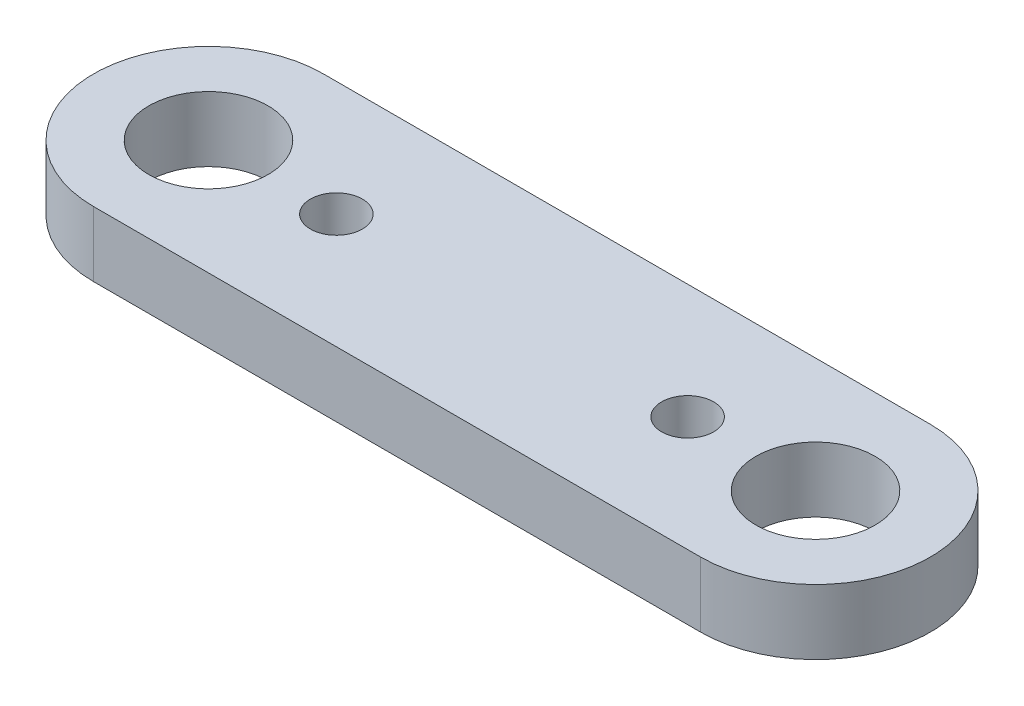
ISO-10303-21;
HEADER;
FILE_DESCRIPTION(('STEP AP214'),'2;1');
FILE_NAME('part.step','',(''),(''),'','','');
FILE_SCHEMA(('AUTOMOTIVE_DESIGN { 1 0 10303 214 1 1 1 1 }'));
ENDSEC;
DATA;
#1=APPLICATION_CONTEXT('core data for automotive mechanical design processes');
#2=APPLICATION_PROTOCOL_DEFINITION('international standard','automotive_design',2000,#1);
#3=PRODUCT_CONTEXT('',#1,'mechanical');
#4=PRODUCT('Part','Part','',(#3));
#5=PRODUCT_RELATED_PRODUCT_CATEGORY('part','',(#4));
#6=PRODUCT_DEFINITION_FORMATION('','',#4);
#7=PRODUCT_DEFINITION_CONTEXT('part definition',#1,'design');
#8=PRODUCT_DEFINITION('design','',#6,#7);
#9=PRODUCT_DEFINITION_SHAPE('','',#8);
#10=(LENGTH_UNIT() NAMED_UNIT(*) SI_UNIT(.MILLI.,.METRE.));
#11=(NAMED_UNIT(*) PLANE_ANGLE_UNIT() SI_UNIT($,.RADIAN.));
#12=(NAMED_UNIT(*) SI_UNIT($,.STERADIAN.) SOLID_ANGLE_UNIT());
#13=UNCERTAINTY_MEASURE_WITH_UNIT(LENGTH_MEASURE(1.E-05),#10,'distance_accuracy_value','');
#14=(GEOMETRIC_REPRESENTATION_CONTEXT(3) GLOBAL_UNCERTAINTY_ASSIGNED_CONTEXT((#13)) GLOBAL_UNIT_ASSIGNED_CONTEXT((#10,
#11,#12)) REPRESENTATION_CONTEXT('',''));
#15=CARTESIAN_POINT('',(0.,0.,0.));
#16=DIRECTION('',(0.,0.,1.));
#17=DIRECTION('',(1.,0.,0.));
#18=AXIS2_PLACEMENT_3D('',#15,#16,#17);
#19=CARTESIAN_POINT('',(14.,3.,0.));
#20=DIRECTION('',(0.,-1.,0.));
#21=DIRECTION('',(0.,0.,-1.));
#22=AXIS2_PLACEMENT_3D('',#19,#20,#21);
#23=PLANE('',#22);
#24=CARTESIAN_POINT('',(14.,3.,0.));
#25=DIRECTION('',(0.,1.,0.));
#26=DIRECTION('',(0.,0.,-1.));
#27=AXIS2_PLACEMENT_3D('',#24,#25,#26);
#28=CIRCLE('',#27,5.3);
#29=CARTESIAN_POINT('',(14.,3.,5.3));
#30=VERTEX_POINT('',#29);
#31=CARTESIAN_POINT('',(14.,3.,-5.3));
#32=VERTEX_POINT('',#31);
#33=EDGE_CURVE('E87',#30,#32,#28,.T.);
#34=ORIENTED_EDGE('',*,*,#33,.T.);
#35=DIRECTION('',(-1.,0.,0.));
#36=VECTOR('',#35,1.);
#37=CARTESIAN_POINT('',(-14.,3.,-5.3));
#38=LINE('',#37,#36);
#39=CARTESIAN_POINT('',(-14.,3.,-5.3));
#40=VERTEX_POINT('',#39);
#41=EDGE_CURVE('E82',#32,#40,#38,.T.);
#42=ORIENTED_EDGE('',*,*,#41,.T.);
#43=CARTESIAN_POINT('',(-14.,3.,0.));
#44=DIRECTION('',(0.,1.,0.));
#45=DIRECTION('',(0.,0.,1.));
#46=AXIS2_PLACEMENT_3D('',#43,#44,#45);
#47=CIRCLE('',#46,5.3);
#48=CARTESIAN_POINT('',(-14.,3.,5.3));
#49=VERTEX_POINT('',#48);
#50=EDGE_CURVE('E85',#40,#49,#47,.T.);
#51=ORIENTED_EDGE('',*,*,#50,.T.);
#52=DIRECTION('',(1.,0.,0.));
#53=VECTOR('',#52,1.);
#54=CARTESIAN_POINT('',(-14.,3.,5.3));
#55=LINE('',#54,#53);
#56=EDGE_CURVE('E52',#49,#30,#55,.T.);
#57=ORIENTED_EDGE('',*,*,#56,.T.);
#58=EDGE_LOOP('',(#34,#42,#51,#57));
#59=FACE_BOUND('',#58,.T.);
#60=CARTESIAN_POINT('',(-14.,3.,0.));
#61=DIRECTION('',(0.,1.,0.));
#62=DIRECTION('',(0.,0.,1.));
#63=AXIS2_PLACEMENT_3D('',#60,#61,#62);
#64=CIRCLE('',#63,2.75);
#65=CARTESIAN_POINT('',(-14.,3.,2.75));
#66=VERTEX_POINT('',#65);
#67=EDGE_CURVE('E102',#66,#66,#64,.T.);
#68=ORIENTED_EDGE('',*,*,#67,.F.);
#69=EDGE_LOOP('',(#68));
#70=FACE_BOUND('',#69,.T.);
#71=CARTESIAN_POINT('',(14.,3.,0.));
#72=DIRECTION('',(0.,1.,0.));
#73=DIRECTION('',(0.,0.,-1.));
#74=AXIS2_PLACEMENT_3D('',#71,#72,#73);
#75=CIRCLE('',#74,2.75);
#76=CARTESIAN_POINT('',(14.,3.,-2.75));
#77=VERTEX_POINT('',#76);
#78=EDGE_CURVE('E117',#77,#77,#75,.T.);
#79=ORIENTED_EDGE('',*,*,#78,.F.);
#80=EDGE_LOOP('',(#79));
#81=FACE_BOUND('',#80,.T.);
#82=CARTESIAN_POINT('',(8.1,3.,0.));
#83=DIRECTION('',(0.,1.,0.));
#84=DIRECTION('',(0.,0.,1.));
#85=AXIS2_PLACEMENT_3D('',#82,#83,#84);
#86=CIRCLE('',#85,1.2);
#87=CARTESIAN_POINT('',(8.1,3.,1.2));
#88=VERTEX_POINT('',#87);
#89=EDGE_CURVE('E123',#88,#88,#86,.T.);
#90=ORIENTED_EDGE('',*,*,#89,.F.);
#91=EDGE_LOOP('',(#90));
#92=FACE_BOUND('',#91,.T.);
#93=CARTESIAN_POINT('',(-8.1,3.,0.));
#94=DIRECTION('',(0.,1.,0.));
#95=DIRECTION('',(0.,0.,-1.));
#96=AXIS2_PLACEMENT_3D('',#93,#94,#95);
#97=CIRCLE('',#96,1.2);
#98=CARTESIAN_POINT('',(-8.1,3.,-1.2));
#99=VERTEX_POINT('',#98);
#100=EDGE_CURVE('E129',#99,#99,#97,.T.);
#101=ORIENTED_EDGE('',*,*,#100,.F.);
#102=EDGE_LOOP('',(#101));
#103=FACE_BOUND('',#102,.T.);
#104=ADVANCED_FACE('F35',(#59,#70,#81,#92,#103),#23,.F.);
#105=CARTESIAN_POINT('',(14.,0.,0.));
#106=DIRECTION('',(0.,-1.,0.));
#107=DIRECTION('',(0.,0.,-1.));
#108=AXIS2_PLACEMENT_3D('',#105,#106,#107);
#109=PLANE('',#108);
#110=CARTESIAN_POINT('',(8.1,0.,0.));
#111=DIRECTION('',(0.,1.,0.));
#112=DIRECTION('',(0.,0.,1.));
#113=AXIS2_PLACEMENT_3D('',#110,#111,#112);
#114=CIRCLE('',#113,1.2);
#115=CARTESIAN_POINT('',(8.1,0.,1.2));
#116=VERTEX_POINT('',#115);
#117=EDGE_CURVE('E126',#116,#116,#114,.T.);
#118=ORIENTED_EDGE('',*,*,#117,.T.);
#119=EDGE_LOOP('',(#118));
#120=FACE_BOUND('',#119,.T.);
#121=CARTESIAN_POINT('',(-14.,0.,0.));
#122=DIRECTION('',(0.,1.,0.));
#123=DIRECTION('',(0.,0.,1.));
#124=AXIS2_PLACEMENT_3D('',#121,#122,#123);
#125=CIRCLE('',#124,2.75);
#126=CARTESIAN_POINT('',(-14.,0.,2.75));
#127=VERTEX_POINT('',#126);
#128=EDGE_CURVE('E114',#127,#127,#125,.T.);
#129=ORIENTED_EDGE('',*,*,#128,.T.);
#130=EDGE_LOOP('',(#129));
#131=FACE_BOUND('',#130,.T.);
#132=CARTESIAN_POINT('',(14.,0.,0.));
#133=DIRECTION('',(0.,1.,0.));
#134=DIRECTION('',(0.,0.,-1.));
#135=AXIS2_PLACEMENT_3D('',#132,#133,#134);
#136=CIRCLE('',#135,5.3);
#137=CARTESIAN_POINT('',(14.,0.,5.3));
#138=VERTEX_POINT('',#137);
#139=CARTESIAN_POINT('',(14.,0.,-5.3));
#140=VERTEX_POINT('',#139);
#141=EDGE_CURVE('E99',#138,#140,#136,.T.);
#142=ORIENTED_EDGE('',*,*,#141,.F.);
#143=DIRECTION('',(1.,0.,0.));
#144=VECTOR('',#143,1.);
#145=CARTESIAN_POINT('',(-14.,0.,5.3));
#146=LINE('',#145,#144);
#147=CARTESIAN_POINT('',(-14.,0.,5.3));
#148=VERTEX_POINT('',#147);
#149=EDGE_CURVE('E75',#148,#138,#146,.T.);
#150=ORIENTED_EDGE('',*,*,#149,.F.);
#151=CARTESIAN_POINT('',(-14.,0.,0.));
#152=DIRECTION('',(0.,1.,0.));
#153=DIRECTION('',(0.,0.,1.));
#154=AXIS2_PLACEMENT_3D('',#151,#152,#153);
#155=CIRCLE('',#154,5.3);
#156=CARTESIAN_POINT('',(-14.,0.,-5.3));
#157=VERTEX_POINT('',#156);
#158=EDGE_CURVE('E69',#157,#148,#155,.T.);
#159=ORIENTED_EDGE('',*,*,#158,.F.);
#160=DIRECTION('',(-1.,0.,0.));
#161=VECTOR('',#160,1.);
#162=CARTESIAN_POINT('',(-14.,0.,-5.3));
#163=LINE('',#162,#161);
#164=EDGE_CURVE('E91',#140,#157,#163,.T.);
#165=ORIENTED_EDGE('',*,*,#164,.F.);
#166=EDGE_LOOP('',(#142,#150,#159,#165));
#167=FACE_BOUND('',#166,.T.);
#168=CARTESIAN_POINT('',(14.,0.,0.));
#169=DIRECTION('',(0.,1.,0.));
#170=DIRECTION('',(0.,0.,-1.));
#171=AXIS2_PLACEMENT_3D('',#168,#169,#170);
#172=CIRCLE('',#171,2.75);
#173=CARTESIAN_POINT('',(14.,0.,-2.75));
#174=VERTEX_POINT('',#173);
#175=EDGE_CURVE('E120',#174,#174,#172,.T.);
#176=ORIENTED_EDGE('',*,*,#175,.T.);
#177=EDGE_LOOP('',(#176));
#178=FACE_BOUND('',#177,.T.);
#179=CARTESIAN_POINT('',(-8.1,0.,0.));
#180=DIRECTION('',(0.,1.,0.));
#181=DIRECTION('',(0.,0.,-1.));
#182=AXIS2_PLACEMENT_3D('',#179,#180,#181);
#183=CIRCLE('',#182,1.2);
#184=CARTESIAN_POINT('',(-8.1,0.,-1.2));
#185=VERTEX_POINT('',#184);
#186=EDGE_CURVE('E132',#185,#185,#183,.T.);
#187=ORIENTED_EDGE('',*,*,#186,.T.);
#188=EDGE_LOOP('',(#187));
#189=FACE_BOUND('',#188,.T.);
#190=ADVANCED_FACE('F110',(#120,#131,#167,#178,#189),#109,.T.);
#191=CARTESIAN_POINT('',(14.,3.,0.));
#192=DIRECTION('',(0.,-1.,0.));
#193=DIRECTION('',(0.,0.,-1.));
#194=AXIS2_PLACEMENT_3D('',#191,#192,#193);
#195=CYLINDRICAL_SURFACE('',#194,5.3);
#196=ORIENTED_EDGE('',*,*,#141,.T.);
#197=DIRECTION('',(0.,-1.,0.));
#198=VECTOR('',#197,1.);
#199=CARTESIAN_POINT('',(14.,3.,-5.3));
#200=LINE('',#199,#198);
#201=EDGE_CURVE('E11',#32,#140,#200,.T.);
#202=ORIENTED_EDGE('',*,*,#201,.F.);
#203=ORIENTED_EDGE('',*,*,#33,.F.);
#204=DIRECTION('',(0.,-1.,0.));
#205=VECTOR('',#204,1.);
#206=CARTESIAN_POINT('',(14.,3.,5.3));
#207=LINE('',#206,#205);
#208=EDGE_CURVE('E95',#30,#138,#207,.T.);
#209=ORIENTED_EDGE('',*,*,#208,.T.);
#210=EDGE_LOOP('',(#196,#202,#203,#209));
#211=FACE_BOUND('',#210,.T.);
#212=ADVANCED_FACE('F37',(#211),#195,.T.);
#213=CARTESIAN_POINT('',(-14.,3.,-5.3));
#214=DIRECTION('',(0.,0.,1.));
#215=DIRECTION('',(1.,0.,0.));
#216=AXIS2_PLACEMENT_3D('',#213,#214,#215);
#217=PLANE('',#216);
#218=ORIENTED_EDGE('',*,*,#164,.T.);
#219=DIRECTION('',(0.,-1.,0.));
#220=VECTOR('',#219,1.);
#221=CARTESIAN_POINT('',(-14.,3.,-5.3));
#222=LINE('',#221,#220);
#223=EDGE_CURVE('E44',#40,#157,#222,.T.);
#224=ORIENTED_EDGE('',*,*,#223,.F.);
#225=ORIENTED_EDGE('',*,*,#41,.F.);
#226=ORIENTED_EDGE('',*,*,#201,.T.);
#227=EDGE_LOOP('',(#218,#224,#225,#226));
#228=FACE_BOUND('',#227,.T.);
#229=ADVANCED_FACE('F90',(#228),#217,.F.);
#230=CARTESIAN_POINT('',(-14.,3.,0.));
#231=DIRECTION('',(0.,-1.,0.));
#232=DIRECTION('',(0.,0.,-1.));
#233=AXIS2_PLACEMENT_3D('',#230,#231,#232);
#234=CYLINDRICAL_SURFACE('',#233,5.3);
#235=ORIENTED_EDGE('',*,*,#158,.T.);
#236=DIRECTION('',(0.,-1.,0.));
#237=VECTOR('',#236,1.);
#238=CARTESIAN_POINT('',(-14.,3.,5.3));
#239=LINE('',#238,#237);
#240=EDGE_CURVE('E92',#49,#148,#239,.T.);
#241=ORIENTED_EDGE('',*,*,#240,.F.);
#242=ORIENTED_EDGE('',*,*,#50,.F.);
#243=ORIENTED_EDGE('',*,*,#223,.T.);
#244=EDGE_LOOP('',(#235,#241,#242,#243));
#245=FACE_BOUND('',#244,.T.);
#246=ADVANCED_FACE('F93',(#245),#234,.T.);
#247=CARTESIAN_POINT('',(-14.,3.,5.3));
#248=DIRECTION('',(0.,0.,-1.));
#249=DIRECTION('',(-1.,0.,0.));
#250=AXIS2_PLACEMENT_3D('',#247,#248,#249);
#251=PLANE('',#250);
#252=ORIENTED_EDGE('',*,*,#149,.T.);
#253=ORIENTED_EDGE('',*,*,#208,.F.);
#254=ORIENTED_EDGE('',*,*,#56,.F.);
#255=ORIENTED_EDGE('',*,*,#240,.T.);
#256=EDGE_LOOP('',(#252,#253,#254,#255));
#257=FACE_BOUND('',#256,.T.);
#258=ADVANCED_FACE('F107',(#257),#251,.F.);
#259=CARTESIAN_POINT('',(-14.,3.,0.));
#260=DIRECTION('',(0.,-1.,0.));
#261=DIRECTION('',(0.,0.,-1.));
#262=AXIS2_PLACEMENT_3D('',#259,#260,#261);
#263=CYLINDRICAL_SURFACE('',#262,2.75);
#264=ORIENTED_EDGE('',*,*,#67,.T.);
#265=EDGE_LOOP('',(#264));
#266=FACE_BOUND('',#265,.T.);
#267=ORIENTED_EDGE('',*,*,#128,.F.);
#268=EDGE_LOOP('',(#267));
#269=FACE_BOUND('',#268,.T.);
#270=ADVANCED_FACE('F149',(#266,#269),#263,.F.);
#271=CARTESIAN_POINT('',(14.,3.,0.));
#272=DIRECTION('',(0.,-1.,0.));
#273=DIRECTION('',(0.,0.,-1.));
#274=AXIS2_PLACEMENT_3D('',#271,#272,#273);
#275=CYLINDRICAL_SURFACE('',#274,2.75);
#276=ORIENTED_EDGE('',*,*,#78,.T.);
#277=EDGE_LOOP('',(#276));
#278=FACE_BOUND('',#277,.T.);
#279=ORIENTED_EDGE('',*,*,#175,.F.);
#280=EDGE_LOOP('',(#279));
#281=FACE_BOUND('',#280,.T.);
#282=ADVANCED_FACE('F195',(#278,#281),#275,.F.);
#283=CARTESIAN_POINT('',(8.1,3.,0.));
#284=DIRECTION('',(0.,-1.,0.));
#285=DIRECTION('',(0.,0.,-1.));
#286=AXIS2_PLACEMENT_3D('',#283,#284,#285);
#287=CYLINDRICAL_SURFACE('',#286,1.2);
#288=ORIENTED_EDGE('',*,*,#89,.T.);
#289=EDGE_LOOP('',(#288));
#290=FACE_BOUND('',#289,.T.);
#291=ORIENTED_EDGE('',*,*,#117,.F.);
#292=EDGE_LOOP('',(#291));
#293=FACE_BOUND('',#292,.T.);
#294=ADVANCED_FACE('F203',(#290,#293),#287,.F.);
#295=CARTESIAN_POINT('',(-8.1,3.,0.));
#296=DIRECTION('',(0.,-1.,0.));
#297=DIRECTION('',(0.,0.,-1.));
#298=AXIS2_PLACEMENT_3D('',#295,#296,#297);
#299=CYLINDRICAL_SURFACE('',#298,1.2);
#300=ORIENTED_EDGE('',*,*,#100,.T.);
#301=EDGE_LOOP('',(#300));
#302=FACE_BOUND('',#301,.T.);
#303=ORIENTED_EDGE('',*,*,#186,.F.);
#304=EDGE_LOOP('',(#303));
#305=FACE_BOUND('',#304,.T.);
#306=ADVANCED_FACE('F138',(#302,#305),#299,.F.);
#307=CLOSED_SHELL('',(#104,#190,#212,#229,#246,#258,#270,#282,#294,#306));
#308=MANIFOLD_SOLID_BREP('B2',#307);
#309=ADVANCED_BREP_SHAPE_REPRESENTATION('',(#18,#308),#14);
#310=SHAPE_DEFINITION_REPRESENTATION(#9,#309);
ENDSEC;
END-ISO-10303-21;
